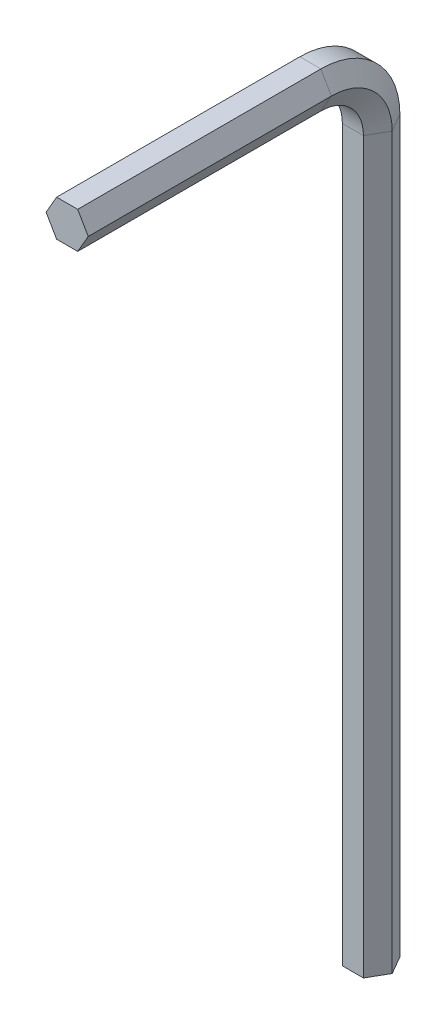
ISO-10303-21;
HEADER;
FILE_DESCRIPTION(('STEP AP214'),'2;1');
FILE_NAME('part.step','',(''),(''),'','','');
FILE_SCHEMA(('AUTOMOTIVE_DESIGN { 1 0 10303 214 1 1 1 1 }'));
ENDSEC;
DATA;
#1=APPLICATION_CONTEXT('core data for automotive mechanical design processes');
#2=APPLICATION_PROTOCOL_DEFINITION('international standard','automotive_design',2000,#1);
#3=PRODUCT_CONTEXT('',#1,'mechanical');
#4=PRODUCT('Part','Part','',(#3));
#5=PRODUCT_RELATED_PRODUCT_CATEGORY('part','',(#4));
#6=PRODUCT_DEFINITION_FORMATION('','',#4);
#7=PRODUCT_DEFINITION_CONTEXT('part definition',#1,'design');
#8=PRODUCT_DEFINITION('design','',#6,#7);
#9=PRODUCT_DEFINITION_SHAPE('','',#8);
#10=(LENGTH_UNIT() NAMED_UNIT(*) SI_UNIT(.MILLI.,.METRE.));
#11=(NAMED_UNIT(*) PLANE_ANGLE_UNIT() SI_UNIT($,.RADIAN.));
#12=(NAMED_UNIT(*) SI_UNIT($,.STERADIAN.) SOLID_ANGLE_UNIT());
#13=UNCERTAINTY_MEASURE_WITH_UNIT(LENGTH_MEASURE(1.E-05),#10,'distance_accuracy_value','');
#14=(GEOMETRIC_REPRESENTATION_CONTEXT(3) GLOBAL_UNCERTAINTY_ASSIGNED_CONTEXT((#13)) GLOBAL_UNIT_ASSIGNED_CONTEXT((#10,
#11,#12)) REPRESENTATION_CONTEXT('',''));
#15=CARTESIAN_POINT('',(0.,0.,0.));
#16=DIRECTION('',(0.,0.,1.));
#17=DIRECTION('',(1.,0.,0.));
#18=AXIS2_PLACEMENT_3D('',#15,#16,#17);
#19=CARTESIAN_POINT('',(0.,0.,0.));
#20=DIRECTION('',(0.,0.,1.));
#21=DIRECTION('',(1.,0.,0.));
#22=AXIS2_PLACEMENT_3D('',#19,#20,#21);
#23=PLANE('',#22);
#24=DIRECTION('',(0.499999999999995,0.866025403784441,0.));
#25=VECTOR('',#24,1.);
#26=CARTESIAN_POINT('',(0.866025403784457,-1.49999999999999,0.));
#27=LINE('',#26,#25);
#28=CARTESIAN_POINT('',(0.866025403784457,-1.49999999999999,0.));
#29=VERTEX_POINT('',#28);
#30=CARTESIAN_POINT('',(1.73205080756888,0.,0.));
#31=VERTEX_POINT('',#30);
#32=EDGE_CURVE('E204',#29,#31,#27,.T.);
#33=ORIENTED_EDGE('',*,*,#32,.T.);
#34=DIRECTION('',(-0.500000000000001,0.866025403784438,0.));
#35=VECTOR('',#34,1.);
#36=CARTESIAN_POINT('',(1.73205080756888,0.,0.));
#37=LINE('',#36,#35);
#38=CARTESIAN_POINT('',(0.866025403784436,1.5,0.));
#39=VERTEX_POINT('',#38);
#40=EDGE_CURVE('E158',#31,#39,#37,.T.);
#41=ORIENTED_EDGE('',*,*,#40,.T.);
#42=DIRECTION('',(-1.,0.,0.));
#43=VECTOR('',#42,1.);
#44=CARTESIAN_POINT('',(0.866025403784436,1.5,0.));
#45=LINE('',#44,#43);
#46=CARTESIAN_POINT('',(-0.866025403784446,1.5,0.));
#47=VERTEX_POINT('',#46);
#48=EDGE_CURVE('E150',#39,#47,#45,.T.);
#49=ORIENTED_EDGE('',*,*,#48,.T.);
#50=DIRECTION('',(-0.499999999999995,-0.866025403784442,0.));
#51=VECTOR('',#50,1.);
#52=CARTESIAN_POINT('',(-0.866025403784446,1.5,0.));
#53=LINE('',#52,#51);
#54=CARTESIAN_POINT('',(-1.73205080756888,0.,0.));
#55=VERTEX_POINT('',#54);
#56=EDGE_CURVE('E143',#47,#55,#53,.T.);
#57=ORIENTED_EDGE('',*,*,#56,.T.);
#58=DIRECTION('',(0.500000000000007,-0.866025403784435,0.));
#59=VECTOR('',#58,1.);
#60=CARTESIAN_POINT('',(-1.73205080756888,0.,0.));
#61=LINE('',#60,#59);
#62=CARTESIAN_POINT('',(-0.866025403784425,-1.50000000000001,0.));
#63=VERTEX_POINT('',#62);
#64=EDGE_CURVE('E242',#55,#63,#61,.T.);
#65=ORIENTED_EDGE('',*,*,#64,.T.);
#66=DIRECTION('',(1.,0.,0.));
#67=VECTOR('',#66,1.);
#68=CARTESIAN_POINT('',(-0.866025403784425,-1.50000000000001,0.));
#69=LINE('',#68,#67);
#70=EDGE_CURVE('E263',#63,#29,#69,.T.);
#71=ORIENTED_EDGE('',*,*,#70,.T.);
#72=EDGE_LOOP('',(#33,#41,#49,#57,#65,#71));
#73=FACE_BOUND('',#72,.T.);
#74=ADVANCED_FACE('F43',(#73),#23,.T.);
#75=CARTESIAN_POINT('',(0.,-65.,-25.));
#76=DIRECTION('',(0.,1.,0.));
#77=DIRECTION('',(1.,0.,0.));
#78=AXIS2_PLACEMENT_3D('',#75,#76,#77);
#79=PLANE('',#78);
#80=DIRECTION('',(0.499999999999995,0.,-0.866025403784441));
#81=VECTOR('',#80,1.);
#82=CARTESIAN_POINT('',(0.866025403784457,-65.,-23.5));
#83=LINE('',#82,#81);
#84=CARTESIAN_POINT('',(0.866025403784457,-65.,-23.5));
#85=VERTEX_POINT('',#84);
#86=CARTESIAN_POINT('',(1.73205080756888,-65.,-25.));
#87=VERTEX_POINT('',#86);
#88=EDGE_CURVE('E172',#85,#87,#83,.T.);
#89=ORIENTED_EDGE('',*,*,#88,.F.);
#90=DIRECTION('',(1.,0.,0.));
#91=VECTOR('',#90,1.);
#92=CARTESIAN_POINT('',(-0.866025403784425,-65.,-23.5));
#93=LINE('',#92,#91);
#94=CARTESIAN_POINT('',(-0.866025403784425,-65.,-23.5));
#95=VERTEX_POINT('',#94);
#96=EDGE_CURVE('E11',#95,#85,#93,.T.);
#97=ORIENTED_EDGE('',*,*,#96,.F.);
#98=DIRECTION('',(0.500000000000007,0.,0.866025403784435));
#99=VECTOR('',#98,1.);
#100=CARTESIAN_POINT('',(-1.73205080756888,-65.,-25.));
#101=LINE('',#100,#99);
#102=CARTESIAN_POINT('',(-1.73205080756888,-65.,-25.));
#103=VERTEX_POINT('',#102);
#104=EDGE_CURVE('E58',#103,#95,#101,.T.);
#105=ORIENTED_EDGE('',*,*,#104,.F.);
#106=DIRECTION('',(-0.499999999999995,0.,0.866025403784442));
#107=VECTOR('',#106,1.);
#108=CARTESIAN_POINT('',(-0.866025403784446,-65.,-26.5));
#109=LINE('',#108,#107);
#110=CARTESIAN_POINT('',(-0.866025403784446,-65.,-26.5));
#111=VERTEX_POINT('',#110);
#112=EDGE_CURVE('E67',#111,#103,#109,.T.);
#113=ORIENTED_EDGE('',*,*,#112,.F.);
#114=DIRECTION('',(-1.,0.,0.));
#115=VECTOR('',#114,1.);
#116=CARTESIAN_POINT('',(0.866025403784436,-65.,-26.5));
#117=LINE('',#116,#115);
#118=CARTESIAN_POINT('',(0.866025403784436,-65.,-26.5));
#119=VERTEX_POINT('',#118);
#120=EDGE_CURVE('E186',#119,#111,#117,.T.);
#121=ORIENTED_EDGE('',*,*,#120,.F.);
#122=DIRECTION('',(-0.500000000000001,0.,-0.866025403784438));
#123=VECTOR('',#122,1.);
#124=CARTESIAN_POINT('',(1.73205080756888,-65.,-25.));
#125=LINE('',#124,#123);
#126=EDGE_CURVE('E184',#87,#119,#125,.T.);
#127=ORIENTED_EDGE('',*,*,#126,.F.);
#128=EDGE_LOOP('',(#89,#97,#105,#113,#121,#127));
#129=FACE_BOUND('',#128,.T.);
#130=ADVANCED_FACE('F185',(#129),#79,.F.);
#131=CARTESIAN_POINT('',(0.866025403784457,-1.49999999999999,0.));
#132=DIRECTION('',(-0.866025403784441,0.499999999999995,0.));
#133=DIRECTION('',(-0.499999999999995,-0.866025403784442,0.));
#134=AXIS2_PLACEMENT_3D('',#131,#132,#133);
#135=PLANE('',#134);
#136=DIRECTION('',(0.,0.,-1.));
#137=VECTOR('',#136,1.);
#138=CARTESIAN_POINT('',(1.73205080756888,0.,0.));
#139=LINE('',#138,#137);
#140=CARTESIAN_POINT('',(1.73205080756888,0.,-20.));
#141=VERTEX_POINT('',#140);
#142=EDGE_CURVE('E210',#31,#141,#139,.T.);
#143=ORIENTED_EDGE('',*,*,#142,.F.);
#144=ORIENTED_EDGE('',*,*,#32,.F.);
#145=DIRECTION('',(0.,0.,-1.));
#146=VECTOR('',#145,1.);
#147=CARTESIAN_POINT('',(0.866025403784457,-1.49999999999999,0.));
#148=LINE('',#147,#146);
#149=CARTESIAN_POINT('',(0.866025403784457,-1.49999999999999,-20.));
#150=VERTEX_POINT('',#149);
#151=EDGE_CURVE('E286',#29,#150,#148,.T.);
#152=ORIENTED_EDGE('',*,*,#151,.T.);
#153=DIRECTION('',(0.499999999999995,0.866025403784441,0.));
#154=VECTOR('',#153,1.);
#155=CARTESIAN_POINT('',(0.866025403784457,-1.49999999999999,-20.));
#156=LINE('',#155,#154);
#157=EDGE_CURVE('E305',#150,#141,#156,.T.);
#158=ORIENTED_EDGE('',*,*,#157,.T.);
#159=EDGE_LOOP('',(#143,#144,#152,#158));
#160=FACE_BOUND('',#159,.T.);
#161=ADVANCED_FACE('F322',(#160),#135,.F.);
#162=CARTESIAN_POINT('',(1.73205080756888,0.,0.));
#163=DIRECTION('',(-0.866025403784438,-0.500000000000001,0.));
#164=DIRECTION('',(0.500000000000001,-0.866025403784438,0.));
#165=AXIS2_PLACEMENT_3D('',#162,#163,#164);
#166=PLANE('',#165);
#167=DIRECTION('',(0.,0.,-1.));
#168=VECTOR('',#167,1.);
#169=CARTESIAN_POINT('',(0.866025403784436,1.5,0.));
#170=LINE('',#169,#168);
#171=CARTESIAN_POINT('',(0.866025403784436,1.5,-20.));
#172=VERTEX_POINT('',#171);
#173=EDGE_CURVE('E209',#39,#172,#170,.T.);
#174=ORIENTED_EDGE('',*,*,#173,.F.);
#175=ORIENTED_EDGE('',*,*,#40,.F.);
#176=ORIENTED_EDGE('',*,*,#142,.T.);
#177=DIRECTION('',(-0.500000000000001,0.866025403784438,0.));
#178=VECTOR('',#177,1.);
#179=CARTESIAN_POINT('',(1.73205080756888,0.,-20.));
#180=LINE('',#179,#178);
#181=EDGE_CURVE('E205',#141,#172,#180,.T.);
#182=ORIENTED_EDGE('',*,*,#181,.T.);
#183=EDGE_LOOP('',(#174,#175,#176,#182));
#184=FACE_BOUND('',#183,.T.);
#185=ADVANCED_FACE('F323',(#184),#166,.F.);
#186=CARTESIAN_POINT('',(0.866025403784436,1.5,0.));
#187=DIRECTION('',(0.,-1.,0.));
#188=DIRECTION('',(1.,0.,0.));
#189=AXIS2_PLACEMENT_3D('',#186,#187,#188);
#190=PLANE('',#189);
#191=DIRECTION('',(0.,0.,-1.));
#192=VECTOR('',#191,1.);
#193=CARTESIAN_POINT('',(-0.866025403784446,1.5,0.));
#194=LINE('',#193,#192);
#195=CARTESIAN_POINT('',(-0.866025403784446,1.5,-20.));
#196=VERTEX_POINT('',#195);
#197=EDGE_CURVE('E227',#47,#196,#194,.T.);
#198=ORIENTED_EDGE('',*,*,#197,.F.);
#199=ORIENTED_EDGE('',*,*,#48,.F.);
#200=ORIENTED_EDGE('',*,*,#173,.T.);
#201=DIRECTION('',(-1.,0.,0.));
#202=VECTOR('',#201,1.);
#203=CARTESIAN_POINT('',(0.866025403784436,1.5,-20.));
#204=LINE('',#203,#202);
#205=EDGE_CURVE('E213',#172,#196,#204,.T.);
#206=ORIENTED_EDGE('',*,*,#205,.T.);
#207=EDGE_LOOP('',(#198,#199,#200,#206));
#208=FACE_BOUND('',#207,.T.);
#209=ADVANCED_FACE('F379',(#208),#190,.F.);
#210=CARTESIAN_POINT('',(-0.866025403784446,1.5,0.));
#211=DIRECTION('',(0.866025403784441,-0.499999999999995,0.));
#212=DIRECTION('',(0.499999999999995,0.866025403784442,0.));
#213=AXIS2_PLACEMENT_3D('',#210,#211,#212);
#214=PLANE('',#213);
#215=DIRECTION('',(0.,0.,-1.));
#216=VECTOR('',#215,1.);
#217=CARTESIAN_POINT('',(-1.73205080756888,0.,0.));
#218=LINE('',#217,#216);
#219=CARTESIAN_POINT('',(-1.73205080756888,0.,-20.));
#220=VERTEX_POINT('',#219);
#221=EDGE_CURVE('E246',#55,#220,#218,.T.);
#222=ORIENTED_EDGE('',*,*,#221,.F.);
#223=ORIENTED_EDGE('',*,*,#56,.F.);
#224=ORIENTED_EDGE('',*,*,#197,.T.);
#225=DIRECTION('',(-0.499999999999995,-0.866025403784442,0.));
#226=VECTOR('',#225,1.);
#227=CARTESIAN_POINT('',(-0.866025403784446,1.5,-20.));
#228=LINE('',#227,#226);
#229=EDGE_CURVE('E230',#196,#220,#228,.T.);
#230=ORIENTED_EDGE('',*,*,#229,.T.);
#231=EDGE_LOOP('',(#222,#223,#224,#230));
#232=FACE_BOUND('',#231,.T.);
#233=ADVANCED_FACE('F388',(#232),#214,.F.);
#234=CARTESIAN_POINT('',(-1.73205080756888,0.,0.));
#235=DIRECTION('',(0.866025403784435,0.500000000000007,0.));
#236=DIRECTION('',(-0.500000000000007,0.866025403784435,0.));
#237=AXIS2_PLACEMENT_3D('',#234,#235,#236);
#238=PLANE('',#237);
#239=DIRECTION('',(0.,0.,-1.));
#240=VECTOR('',#239,1.);
#241=CARTESIAN_POINT('',(-0.866025403784425,-1.50000000000001,0.));
#242=LINE('',#241,#240);
#243=CARTESIAN_POINT('',(-0.866025403784425,-1.50000000000001,-20.));
#244=VERTEX_POINT('',#243);
#245=EDGE_CURVE('E267',#63,#244,#242,.T.);
#246=ORIENTED_EDGE('',*,*,#245,.F.);
#247=ORIENTED_EDGE('',*,*,#64,.F.);
#248=ORIENTED_EDGE('',*,*,#221,.T.);
#249=DIRECTION('',(0.500000000000007,-0.866025403784435,0.));
#250=VECTOR('',#249,1.);
#251=CARTESIAN_POINT('',(-1.73205080756888,0.,-20.));
#252=LINE('',#251,#250);
#253=EDGE_CURVE('E250',#220,#244,#252,.T.);
#254=ORIENTED_EDGE('',*,*,#253,.T.);
#255=EDGE_LOOP('',(#246,#247,#248,#254));
#256=FACE_BOUND('',#255,.T.);
#257=ADVANCED_FACE('F398',(#256),#238,.F.);
#258=CARTESIAN_POINT('',(-0.866025403784425,-1.50000000000001,0.));
#259=DIRECTION('',(0.,1.,0.));
#260=DIRECTION('',(-1.,0.,0.));
#261=AXIS2_PLACEMENT_3D('',#258,#259,#260);
#262=PLANE('',#261);
#263=DIRECTION('',(1.,0.,0.));
#264=VECTOR('',#263,1.);
#265=CARTESIAN_POINT('',(-0.866025403784425,-1.50000000000001,-20.));
#266=LINE('',#265,#264);
#267=EDGE_CURVE('E271',#244,#150,#266,.T.);
#268=ORIENTED_EDGE('',*,*,#267,.T.);
#269=ORIENTED_EDGE('',*,*,#151,.F.);
#270=ORIENTED_EDGE('',*,*,#70,.F.);
#271=ORIENTED_EDGE('',*,*,#245,.T.);
#272=EDGE_LOOP('',(#268,#269,#270,#271));
#273=FACE_BOUND('',#272,.T.);
#274=ADVANCED_FACE('F334',(#273),#262,.F.);
#275=CARTESIAN_POINT('',(0.866025403784457,-5.,-20.));
#276=DIRECTION('',(1.,0.,0.));
#277=DIRECTION('',(0.,0.,-1.));
#278=AXIS2_PLACEMENT_3D('',#275,#276,#277);
#279=CONICAL_SURFACE('',#278,3.50000000000001,1.0471975511966);
#280=CARTESIAN_POINT('',(1.73205080756888,-5.,-20.));
#281=DIRECTION('',(-1.,0.,0.));
#282=DIRECTION('',(0.,1.,0.));
#283=AXIS2_PLACEMENT_3D('',#280,#281,#282);
#284=CIRCLE('',#283,5.);
#285=CARTESIAN_POINT('',(1.73205080756888,-5.00000000000003,-25.));
#286=VERTEX_POINT('',#285);
#287=EDGE_CURVE('E216',#141,#286,#284,.T.);
#288=ORIENTED_EDGE('',*,*,#287,.F.);
#289=ORIENTED_EDGE('',*,*,#157,.F.);
#290=CARTESIAN_POINT('',(0.866025403784457,-5.,-20.));
#291=DIRECTION('',(-1.,0.,0.));
#292=DIRECTION('',(0.,1.,0.));
#293=AXIS2_PLACEMENT_3D('',#290,#291,#292);
#294=CIRCLE('',#293,3.50000000000001);
#295=CARTESIAN_POINT('',(0.866025403784457,-5.00000000000002,-23.5));
#296=VERTEX_POINT('',#295);
#297=EDGE_CURVE('E289',#150,#296,#294,.T.);
#298=ORIENTED_EDGE('',*,*,#297,.T.);
#299=DIRECTION('',(0.499999999999995,0.,-0.866025403784441));
#300=VECTOR('',#299,1.);
#301=CARTESIAN_POINT('',(0.866025403784457,-5.00000000000002,-23.5));
#302=LINE('',#301,#300);
#303=EDGE_CURVE('E298',#296,#286,#302,.T.);
#304=ORIENTED_EDGE('',*,*,#303,.T.);
#305=EDGE_LOOP('',(#288,#289,#298,#304));
#306=FACE_BOUND('',#305,.T.);
#307=ADVANCED_FACE('F303',(#306),#279,.F.);
#308=CARTESIAN_POINT('',(1.73205080756888,-5.,-20.));
#309=DIRECTION('',(-1.,0.,0.));
#310=DIRECTION('',(0.,0.,1.));
#311=AXIS2_PLACEMENT_3D('',#308,#309,#310);
#312=CONICAL_SURFACE('',#311,5.,1.0471975511966);
#313=CARTESIAN_POINT('',(0.866025403784436,-5.,-20.));
#314=DIRECTION('',(-1.,0.,0.));
#315=DIRECTION('',(0.,1.,0.));
#316=AXIS2_PLACEMENT_3D('',#313,#314,#315);
#317=CIRCLE('',#316,6.5);
#318=CARTESIAN_POINT('',(0.866025403784436,-5.00000000000004,-26.5));
#319=VERTEX_POINT('',#318);
#320=EDGE_CURVE('E130',#172,#319,#317,.T.);
#321=ORIENTED_EDGE('',*,*,#320,.F.);
#322=ORIENTED_EDGE('',*,*,#181,.F.);
#323=ORIENTED_EDGE('',*,*,#287,.T.);
#324=DIRECTION('',(-0.500000000000001,0.,-0.866025403784438));
#325=VECTOR('',#324,1.);
#326=CARTESIAN_POINT('',(1.73205080756888,-5.00000000000003,-25.));
#327=LINE('',#326,#325);
#328=EDGE_CURVE('E193',#286,#319,#327,.T.);
#329=ORIENTED_EDGE('',*,*,#328,.T.);
#330=EDGE_LOOP('',(#321,#322,#323,#329));
#331=FACE_BOUND('',#330,.T.);
#332=ADVANCED_FACE('F324',(#331),#312,.T.);
#333=CARTESIAN_POINT('',(0.,-5.,-20.));
#334=DIRECTION('',(-1.,0.,0.));
#335=DIRECTION('',(0.,0.,1.));
#336=AXIS2_PLACEMENT_3D('',#333,#334,#335);
#337=CYLINDRICAL_SURFACE('',#336,6.5);
#338=CARTESIAN_POINT('',(-0.866025403784446,-5.,-20.));
#339=DIRECTION('',(-1.,0.,0.));
#340=DIRECTION('',(0.,1.,0.));
#341=AXIS2_PLACEMENT_3D('',#338,#339,#340);
#342=CIRCLE('',#341,6.5);
#343=CARTESIAN_POINT('',(-0.866025403784446,-5.00000000000004,-26.5));
#344=VERTEX_POINT('',#343);
#345=EDGE_CURVE('E122',#196,#344,#342,.T.);
#346=ORIENTED_EDGE('',*,*,#345,.F.);
#347=ORIENTED_EDGE('',*,*,#205,.F.);
#348=ORIENTED_EDGE('',*,*,#320,.T.);
#349=DIRECTION('',(-1.,0.,0.));
#350=VECTOR('',#349,1.);
#351=CARTESIAN_POINT('',(0.866025403784436,-5.00000000000004,-26.5));
#352=LINE('',#351,#350);
#353=EDGE_CURVE('E218',#319,#344,#352,.T.);
#354=ORIENTED_EDGE('',*,*,#353,.T.);
#355=EDGE_LOOP('',(#346,#347,#348,#354));
#356=FACE_BOUND('',#355,.T.);
#357=ADVANCED_FACE('F326',(#356),#337,.T.);
#358=CARTESIAN_POINT('',(-0.866025403784446,-5.,-20.));
#359=DIRECTION('',(1.,0.,0.));
#360=DIRECTION('',(0.,0.,-1.));
#361=AXIS2_PLACEMENT_3D('',#358,#359,#360);
#362=CONICAL_SURFACE('',#361,6.5,1.0471975511966);
#363=CARTESIAN_POINT('',(-1.73205080756888,-5.,-20.));
#364=DIRECTION('',(-1.,0.,0.));
#365=DIRECTION('',(0.,1.,0.));
#366=AXIS2_PLACEMENT_3D('',#363,#364,#365);
#367=CIRCLE('',#366,4.99999999999999);
#368=CARTESIAN_POINT('',(-1.73205080756888,-5.00000000000003,-25.));
#369=VERTEX_POINT('',#368);
#370=EDGE_CURVE('E114',#220,#369,#367,.T.);
#371=ORIENTED_EDGE('',*,*,#370,.F.);
#372=ORIENTED_EDGE('',*,*,#229,.F.);
#373=ORIENTED_EDGE('',*,*,#345,.T.);
#374=DIRECTION('',(-0.499999999999995,0.,0.866025403784442));
#375=VECTOR('',#374,1.);
#376=CARTESIAN_POINT('',(-0.866025403784446,-5.00000000000004,-26.5));
#377=LINE('',#376,#375);
#378=EDGE_CURVE('E235',#344,#369,#377,.T.);
#379=ORIENTED_EDGE('',*,*,#378,.T.);
#380=EDGE_LOOP('',(#371,#372,#373,#379));
#381=FACE_BOUND('',#380,.T.);
#382=ADVANCED_FACE('F332',(#381),#362,.T.);
#383=CARTESIAN_POINT('',(-1.73205080756888,-5.,-20.));
#384=DIRECTION('',(-1.,0.,0.));
#385=DIRECTION('',(0.,0.,1.));
#386=AXIS2_PLACEMENT_3D('',#383,#384,#385);
#387=CONICAL_SURFACE('',#386,4.99999999999999,1.04719755119659);
#388=CARTESIAN_POINT('',(-0.866025403784425,-5.,-20.));
#389=DIRECTION('',(-1.,0.,0.));
#390=DIRECTION('',(0.,1.,0.));
#391=AXIS2_PLACEMENT_3D('',#388,#389,#390);
#392=CIRCLE('',#391,3.49999999999999);
#393=CARTESIAN_POINT('',(-0.866025403784425,-5.00000000000002,-23.5));
#394=VERTEX_POINT('',#393);
#395=EDGE_CURVE('E275',#244,#394,#392,.T.);
#396=ORIENTED_EDGE('',*,*,#395,.F.);
#397=ORIENTED_EDGE('',*,*,#253,.F.);
#398=ORIENTED_EDGE('',*,*,#370,.T.);
#399=DIRECTION('',(0.500000000000007,0.,0.866025403784435));
#400=VECTOR('',#399,1.);
#401=CARTESIAN_POINT('',(-1.73205080756888,-5.00000000000003,-25.));
#402=LINE('',#401,#400);
#403=EDGE_CURVE('E255',#369,#394,#402,.T.);
#404=ORIENTED_EDGE('',*,*,#403,.T.);
#405=EDGE_LOOP('',(#396,#397,#398,#404));
#406=FACE_BOUND('',#405,.T.);
#407=ADVANCED_FACE('F446',(#406),#387,.F.);
#408=CARTESIAN_POINT('',(0.,-5.,-20.));
#409=DIRECTION('',(-1.,0.,0.));
#410=DIRECTION('',(0.,0.,1.));
#411=AXIS2_PLACEMENT_3D('',#408,#409,#410);
#412=CYLINDRICAL_SURFACE('',#411,3.5);
#413=DIRECTION('',(1.,0.,0.));
#414=VECTOR('',#413,1.);
#415=CARTESIAN_POINT('',(-0.866025403784425,-5.00000000000002,-23.5));
#416=LINE('',#415,#414);
#417=EDGE_CURVE('E201',#394,#296,#416,.T.);
#418=ORIENTED_EDGE('',*,*,#417,.T.);
#419=ORIENTED_EDGE('',*,*,#297,.F.);
#420=ORIENTED_EDGE('',*,*,#267,.F.);
#421=ORIENTED_EDGE('',*,*,#395,.T.);
#422=EDGE_LOOP('',(#418,#419,#420,#421));
#423=FACE_BOUND('',#422,.T.);
#424=ADVANCED_FACE('F293',(#423),#412,.F.);
#425=CARTESIAN_POINT('',(0.866025403784457,-5.00000000000003,-23.5));
#426=DIRECTION('',(-0.866025403784442,0.,-0.499999999999995));
#427=DIRECTION('',(-0.499999999999995,0.,0.866025403784442));
#428=AXIS2_PLACEMENT_3D('',#425,#426,#427);
#429=PLANE('',#428);
#430=DIRECTION('',(0.,-1.,0.));
#431=VECTOR('',#430,1.);
#432=CARTESIAN_POINT('',(1.73205080756888,-5.00000000000003,-25.));
#433=LINE('',#432,#431);
#434=EDGE_CURVE('E177',#286,#87,#433,.T.);
#435=ORIENTED_EDGE('',*,*,#434,.F.);
#436=ORIENTED_EDGE('',*,*,#303,.F.);
#437=DIRECTION('',(0.,-1.,0.));
#438=VECTOR('',#437,1.);
#439=CARTESIAN_POINT('',(0.866025403784457,-5.00000000000003,-23.5));
#440=LINE('',#439,#438);
#441=EDGE_CURVE('E179',#296,#85,#440,.T.);
#442=ORIENTED_EDGE('',*,*,#441,.T.);
#443=ORIENTED_EDGE('',*,*,#88,.T.);
#444=EDGE_LOOP('',(#435,#436,#442,#443));
#445=FACE_BOUND('',#444,.T.);
#446=ADVANCED_FACE('F174',(#445),#429,.F.);
#447=CARTESIAN_POINT('',(1.73205080756888,-5.00000000000003,-25.));
#448=DIRECTION('',(-0.866025403784438,0.,0.500000000000001));
#449=DIRECTION('',(0.500000000000001,0.,0.866025403784438));
#450=AXIS2_PLACEMENT_3D('',#447,#448,#449);
#451=PLANE('',#450);
#452=DIRECTION('',(0.,-1.,0.));
#453=VECTOR('',#452,1.);
#454=CARTESIAN_POINT('',(0.866025403784436,-5.00000000000003,-26.5));
#455=LINE('',#454,#453);
#456=EDGE_CURVE('E190',#319,#119,#455,.T.);
#457=ORIENTED_EDGE('',*,*,#456,.F.);
#458=ORIENTED_EDGE('',*,*,#328,.F.);
#459=ORIENTED_EDGE('',*,*,#434,.T.);
#460=ORIENTED_EDGE('',*,*,#126,.T.);
#461=EDGE_LOOP('',(#457,#458,#459,#460));
#462=FACE_BOUND('',#461,.T.);
#463=ADVANCED_FACE('F192',(#462),#451,.F.);
#464=CARTESIAN_POINT('',(0.866025403784436,-5.00000000000003,-26.5));
#465=DIRECTION('',(0.,0.,1.));
#466=DIRECTION('',(1.,0.,0.));
#467=AXIS2_PLACEMENT_3D('',#464,#465,#466);
#468=PLANE('',#467);
#469=DIRECTION('',(0.,-1.,0.));
#470=VECTOR('',#469,1.);
#471=CARTESIAN_POINT('',(-0.866025403784446,-5.00000000000003,-26.5));
#472=LINE('',#471,#470);
#473=EDGE_CURVE('E99',#344,#111,#472,.T.);
#474=ORIENTED_EDGE('',*,*,#473,.F.);
#475=ORIENTED_EDGE('',*,*,#353,.F.);
#476=ORIENTED_EDGE('',*,*,#456,.T.);
#477=ORIENTED_EDGE('',*,*,#120,.T.);
#478=EDGE_LOOP('',(#474,#475,#476,#477));
#479=FACE_BOUND('',#478,.T.);
#480=ADVANCED_FACE('F483',(#479),#468,.F.);
#481=CARTESIAN_POINT('',(-0.866025403784446,-5.00000000000003,-26.5));
#482=DIRECTION('',(0.866025403784442,0.,0.499999999999995));
#483=DIRECTION('',(0.499999999999995,0.,-0.866025403784442));
#484=AXIS2_PLACEMENT_3D('',#481,#482,#483);
#485=PLANE('',#484);
#486=DIRECTION('',(0.,-1.,0.));
#487=VECTOR('',#486,1.);
#488=CARTESIAN_POINT('',(-1.73205080756888,-5.00000000000003,-25.));
#489=LINE('',#488,#487);
#490=EDGE_CURVE('E93',#369,#103,#489,.T.);
#491=ORIENTED_EDGE('',*,*,#490,.F.);
#492=ORIENTED_EDGE('',*,*,#378,.F.);
#493=ORIENTED_EDGE('',*,*,#473,.T.);
#494=ORIENTED_EDGE('',*,*,#112,.T.);
#495=EDGE_LOOP('',(#491,#492,#493,#494));
#496=FACE_BOUND('',#495,.T.);
#497=ADVANCED_FACE('F345',(#496),#485,.F.);
#498=CARTESIAN_POINT('',(-1.73205080756888,-5.00000000000003,-25.));
#499=DIRECTION('',(0.866025403784434,0.,-0.500000000000007));
#500=DIRECTION('',(-0.500000000000007,0.,-0.866025403784435));
#501=AXIS2_PLACEMENT_3D('',#498,#499,#500);
#502=PLANE('',#501);
#503=DIRECTION('',(0.,-1.,0.));
#504=VECTOR('',#503,1.);
#505=CARTESIAN_POINT('',(-0.866025403784425,-5.00000000000003,-23.5));
#506=LINE('',#505,#504);
#507=EDGE_CURVE('E51',#394,#95,#506,.T.);
#508=ORIENTED_EDGE('',*,*,#507,.F.);
#509=ORIENTED_EDGE('',*,*,#403,.F.);
#510=ORIENTED_EDGE('',*,*,#490,.T.);
#511=ORIENTED_EDGE('',*,*,#104,.T.);
#512=EDGE_LOOP('',(#508,#509,#510,#511));
#513=FACE_BOUND('',#512,.T.);
#514=ADVANCED_FACE('F340',(#513),#502,.F.);
#515=CARTESIAN_POINT('',(-0.866025403784425,-5.00000000000003,-23.5));
#516=DIRECTION('',(0.,0.,-1.));
#517=DIRECTION('',(-1.,0.,0.));
#518=AXIS2_PLACEMENT_3D('',#515,#516,#517);
#519=PLANE('',#518);
#520=ORIENTED_EDGE('',*,*,#96,.T.);
#521=ORIENTED_EDGE('',*,*,#441,.F.);
#522=ORIENTED_EDGE('',*,*,#417,.F.);
#523=ORIENTED_EDGE('',*,*,#507,.T.);
#524=EDGE_LOOP('',(#520,#521,#522,#523));
#525=FACE_BOUND('',#524,.T.);
#526=ADVANCED_FACE('F338',(#525),#519,.F.);
#527=CLOSED_SHELL('',(#74,#130,#161,#185,#209,#233,#257,#274,#307,#332,#357,#382,#407,#424,#446,
#463,#480,#497,#514,#526));
#528=MANIFOLD_SOLID_BREP('B2',#527);
#529=ADVANCED_BREP_SHAPE_REPRESENTATION('',(#18,#528),#14);
#530=SHAPE_DEFINITION_REPRESENTATION(#9,#529);
ENDSEC;
END-ISO-10303-21;
